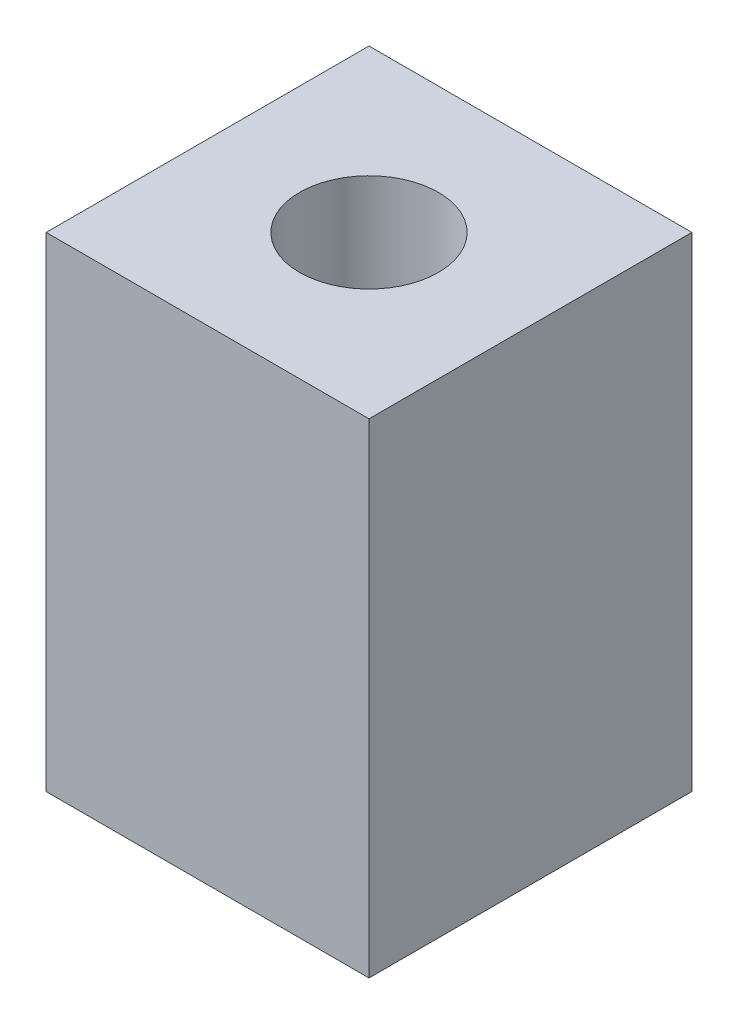
ISO-10303-21;
HEADER;
FILE_DESCRIPTION(('STEP AP214'),'2;1');
FILE_NAME('part.step','',(''),(''),'','','');
FILE_SCHEMA(('AUTOMOTIVE_DESIGN { 1 0 10303 214 1 1 1 1 }'));
ENDSEC;
DATA;
#1=APPLICATION_CONTEXT('core data for automotive mechanical design processes');
#2=APPLICATION_PROTOCOL_DEFINITION('international standard','automotive_design',2000,#1);
#3=PRODUCT_CONTEXT('',#1,'mechanical');
#4=PRODUCT('Part','Part','',(#3));
#5=PRODUCT_RELATED_PRODUCT_CATEGORY('part','',(#4));
#6=PRODUCT_DEFINITION_FORMATION('','',#4);
#7=PRODUCT_DEFINITION_CONTEXT('part definition',#1,'design');
#8=PRODUCT_DEFINITION('design','',#6,#7);
#9=PRODUCT_DEFINITION_SHAPE('','',#8);
#10=(LENGTH_UNIT() NAMED_UNIT(*) SI_UNIT(.MILLI.,.METRE.));
#11=(NAMED_UNIT(*) PLANE_ANGLE_UNIT() SI_UNIT($,.RADIAN.));
#12=(NAMED_UNIT(*) SI_UNIT($,.STERADIAN.) SOLID_ANGLE_UNIT());
#13=UNCERTAINTY_MEASURE_WITH_UNIT(LENGTH_MEASURE(1.E-05),#10,'distance_accuracy_value','');
#14=(GEOMETRIC_REPRESENTATION_CONTEXT(3) GLOBAL_UNCERTAINTY_ASSIGNED_CONTEXT((#13)) GLOBAL_UNIT_ASSIGNED_CONTEXT((#10,
#11,#12)) REPRESENTATION_CONTEXT('',''));
#15=CARTESIAN_POINT('',(0.,0.,0.));
#16=DIRECTION('',(0.,0.,1.));
#17=DIRECTION('',(1.,0.,0.));
#18=AXIS2_PLACEMENT_3D('',#15,#16,#17);
#19=CARTESIAN_POINT('',(-20.,30.,-10.));
#20=DIRECTION('',(1.,0.,0.));
#21=DIRECTION('',(0.,0.,-1.));
#22=AXIS2_PLACEMENT_3D('',#19,#20,#21);
#23=PLANE('',#22);
#24=DIRECTION('',(0.,0.,1.));
#25=VECTOR('',#24,1.);
#26=CARTESIAN_POINT('',(-20.,0.,-10.));
#27=LINE('',#26,#25);
#28=CARTESIAN_POINT('',(-20.,0.,-10.));
#29=VERTEX_POINT('',#28);
#30=CARTESIAN_POINT('',(-20.,0.,10.));
#31=VERTEX_POINT('',#30);
#32=EDGE_CURVE('E113',#29,#31,#27,.T.);
#33=ORIENTED_EDGE('',*,*,#32,.T.);
#34=DIRECTION('',(0.,-1.,0.));
#35=VECTOR('',#34,1.);
#36=CARTESIAN_POINT('',(-20.,30.,10.));
#37=LINE('',#36,#35);
#38=CARTESIAN_POINT('',(-20.,30.,10.));
#39=VERTEX_POINT('',#38);
#40=EDGE_CURVE('E11',#39,#31,#37,.T.);
#41=ORIENTED_EDGE('',*,*,#40,.F.);
#42=DIRECTION('',(0.,0.,1.));
#43=VECTOR('',#42,1.);
#44=CARTESIAN_POINT('',(-20.,30.,-10.));
#45=LINE('',#44,#43);
#46=CARTESIAN_POINT('',(-20.,30.,-10.));
#47=VERTEX_POINT('',#46);
#48=EDGE_CURVE('E97',#47,#39,#45,.T.);
#49=ORIENTED_EDGE('',*,*,#48,.F.);
#50=DIRECTION('',(0.,-1.,0.));
#51=VECTOR('',#50,1.);
#52=CARTESIAN_POINT('',(-20.,30.,-10.));
#53=LINE('',#52,#51);
#54=EDGE_CURVE('E109',#47,#29,#53,.T.);
#55=ORIENTED_EDGE('',*,*,#54,.T.);
#56=EDGE_LOOP('',(#33,#41,#49,#55));
#57=FACE_BOUND('',#56,.T.);
#58=ADVANCED_FACE('F45',(#57),#23,.F.);
#59=CARTESIAN_POINT('',(-20.,30.,10.));
#60=DIRECTION('',(0.,0.,-1.));
#61=DIRECTION('',(-1.,0.,0.));
#62=AXIS2_PLACEMENT_3D('',#59,#60,#61);
#63=PLANE('',#62);
#64=DIRECTION('',(1.,0.,0.));
#65=VECTOR('',#64,1.);
#66=CARTESIAN_POINT('',(-20.,0.,10.));
#67=LINE('',#66,#65);
#68=CARTESIAN_POINT('',(0.,0.,10.));
#69=VERTEX_POINT('',#68);
#70=EDGE_CURVE('E102',#31,#69,#67,.T.);
#71=ORIENTED_EDGE('',*,*,#70,.T.);
#72=DIRECTION('',(0.,-1.,0.));
#73=VECTOR('',#72,1.);
#74=CARTESIAN_POINT('',(0.,30.,10.));
#75=LINE('',#74,#73);
#76=CARTESIAN_POINT('',(0.,30.,10.));
#77=VERTEX_POINT('',#76);
#78=EDGE_CURVE('E54',#77,#69,#75,.T.);
#79=ORIENTED_EDGE('',*,*,#78,.F.);
#80=DIRECTION('',(1.,0.,0.));
#81=VECTOR('',#80,1.);
#82=CARTESIAN_POINT('',(-20.,30.,10.));
#83=LINE('',#82,#81);
#84=EDGE_CURVE('E92',#39,#77,#83,.T.);
#85=ORIENTED_EDGE('',*,*,#84,.F.);
#86=ORIENTED_EDGE('',*,*,#40,.T.);
#87=EDGE_LOOP('',(#71,#79,#85,#86));
#88=FACE_BOUND('',#87,.T.);
#89=ADVANCED_FACE('F101',(#88),#63,.F.);
#90=CARTESIAN_POINT('',(0.,30.,-10.));
#91=DIRECTION('',(-1.,0.,0.));
#92=DIRECTION('',(0.,0.,1.));
#93=AXIS2_PLACEMENT_3D('',#90,#91,#92);
#94=PLANE('',#93);
#95=DIRECTION('',(0.,0.,-1.));
#96=VECTOR('',#95,1.);
#97=CARTESIAN_POINT('',(0.,0.,-10.));
#98=LINE('',#97,#96);
#99=CARTESIAN_POINT('',(0.,0.,-10.));
#100=VERTEX_POINT('',#99);
#101=EDGE_CURVE('E79',#69,#100,#98,.T.);
#102=ORIENTED_EDGE('',*,*,#101,.T.);
#103=DIRECTION('',(0.,-1.,0.));
#104=VECTOR('',#103,1.);
#105=CARTESIAN_POINT('',(0.,30.,-10.));
#106=LINE('',#105,#104);
#107=CARTESIAN_POINT('',(0.,30.,-10.));
#108=VERTEX_POINT('',#107);
#109=EDGE_CURVE('E104',#108,#100,#106,.T.);
#110=ORIENTED_EDGE('',*,*,#109,.F.);
#111=DIRECTION('',(0.,0.,-1.));
#112=VECTOR('',#111,1.);
#113=CARTESIAN_POINT('',(0.,30.,-10.));
#114=LINE('',#113,#112);
#115=EDGE_CURVE('E95',#77,#108,#114,.T.);
#116=ORIENTED_EDGE('',*,*,#115,.F.);
#117=ORIENTED_EDGE('',*,*,#78,.T.);
#118=EDGE_LOOP('',(#102,#110,#116,#117));
#119=FACE_BOUND('',#118,.T.);
#120=ADVANCED_FACE('F105',(#119),#94,.F.);
#121=CARTESIAN_POINT('',(-20.,30.,-10.));
#122=DIRECTION('',(0.,0.,1.));
#123=DIRECTION('',(1.,0.,0.));
#124=AXIS2_PLACEMENT_3D('',#121,#122,#123);
#125=PLANE('',#124);
#126=DIRECTION('',(-1.,0.,0.));
#127=VECTOR('',#126,1.);
#128=CARTESIAN_POINT('',(-20.,0.,-10.));
#129=LINE('',#128,#127);
#130=EDGE_CURVE('E85',#100,#29,#129,.T.);
#131=ORIENTED_EDGE('',*,*,#130,.T.);
#132=ORIENTED_EDGE('',*,*,#54,.F.);
#133=DIRECTION('',(-1.,0.,0.));
#134=VECTOR('',#133,1.);
#135=CARTESIAN_POINT('',(-20.,30.,-10.));
#136=LINE('',#135,#134);
#137=EDGE_CURVE('E62',#108,#47,#136,.T.);
#138=ORIENTED_EDGE('',*,*,#137,.F.);
#139=ORIENTED_EDGE('',*,*,#109,.T.);
#140=EDGE_LOOP('',(#131,#132,#138,#139));
#141=FACE_BOUND('',#140,.T.);
#142=ADVANCED_FACE('F127',(#141),#125,.F.);
#143=CARTESIAN_POINT('',(0.,30.,0.));
#144=DIRECTION('',(0.,1.,0.));
#145=DIRECTION('',(0.,0.,1.));
#146=AXIS2_PLACEMENT_3D('',#143,#144,#145);
#147=PLANE('',#146);
#148=CARTESIAN_POINT('',(-10.,30.,0.));
#149=DIRECTION('',(0.,1.,0.));
#150=DIRECTION('',(0.,0.,1.));
#151=AXIS2_PLACEMENT_3D('',#148,#149,#150);
#152=CIRCLE('',#151,4.3);
#153=CARTESIAN_POINT('',(-10.,30.,4.3));
#154=VERTEX_POINT('',#153);
#155=EDGE_CURVE('E134',#154,#154,#152,.T.);
#156=ORIENTED_EDGE('',*,*,#155,.F.);
#157=EDGE_LOOP('',(#156));
#158=FACE_BOUND('',#157,.T.);
#159=ORIENTED_EDGE('',*,*,#48,.T.);
#160=ORIENTED_EDGE('',*,*,#84,.T.);
#161=ORIENTED_EDGE('',*,*,#115,.T.);
#162=ORIENTED_EDGE('',*,*,#137,.T.);
#163=EDGE_LOOP('',(#159,#160,#161,#162));
#164=FACE_BOUND('',#163,.T.);
#165=ADVANCED_FACE('F93',(#158,#164),#147,.T.);
#166=CARTESIAN_POINT('',(0.,0.,0.));
#167=DIRECTION('',(0.,1.,0.));
#168=DIRECTION('',(0.,0.,1.));
#169=AXIS2_PLACEMENT_3D('',#166,#167,#168);
#170=PLANE('',#169);
#171=CARTESIAN_POINT('',(-10.,0.,0.));
#172=DIRECTION('',(0.,1.,0.));
#173=DIRECTION('',(0.,0.,1.));
#174=AXIS2_PLACEMENT_3D('',#171,#172,#173);
#175=CIRCLE('',#174,4.3);
#176=CARTESIAN_POINT('',(-10.,0.,4.3));
#177=VERTEX_POINT('',#176);
#178=EDGE_CURVE('E117',#177,#177,#175,.T.);
#179=ORIENTED_EDGE('',*,*,#178,.T.);
#180=EDGE_LOOP('',(#179));
#181=FACE_BOUND('',#180,.T.);
#182=ORIENTED_EDGE('',*,*,#32,.F.);
#183=ORIENTED_EDGE('',*,*,#130,.F.);
#184=ORIENTED_EDGE('',*,*,#101,.F.);
#185=ORIENTED_EDGE('',*,*,#70,.F.);
#186=EDGE_LOOP('',(#182,#183,#184,#185));
#187=FACE_BOUND('',#186,.T.);
#188=ADVANCED_FACE('F130',(#181,#187),#170,.F.);
#189=CARTESIAN_POINT('',(-10.,0.,0.));
#190=DIRECTION('',(0.,1.,0.));
#191=DIRECTION('',(0.,0.,1.));
#192=AXIS2_PLACEMENT_3D('',#189,#190,#191);
#193=CYLINDRICAL_SURFACE('',#192,4.3);
#194=ORIENTED_EDGE('',*,*,#178,.F.);
#195=EDGE_LOOP('',(#194));
#196=FACE_BOUND('',#195,.T.);
#197=ORIENTED_EDGE('',*,*,#155,.T.);
#198=EDGE_LOOP('',(#197));
#199=FACE_BOUND('',#198,.T.);
#200=ADVANCED_FACE('F143',(#196,#199),#193,.F.);
#201=CLOSED_SHELL('',(#58,#89,#120,#142,#165,#188,#200));
#202=MANIFOLD_SOLID_BREP('B2',#201);
#203=ADVANCED_BREP_SHAPE_REPRESENTATION('',(#18,#202),#14);
#204=SHAPE_DEFINITION_REPRESENTATION(#9,#203);
ENDSEC;
END-ISO-10303-21;
